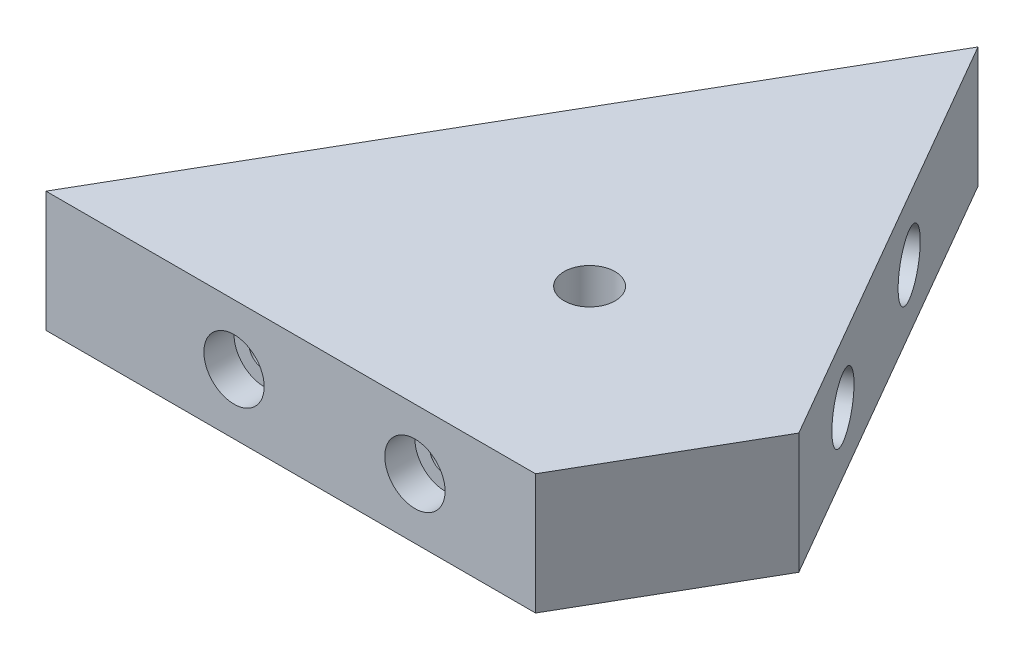
ISO-10303-21;
HEADER;
FILE_DESCRIPTION(('STEP AP214'),'2;1');
FILE_NAME('part.step','',(''),(''),'','','');
FILE_SCHEMA(('AUTOMOTIVE_DESIGN { 1 0 10303 214 1 1 1 1 }'));
ENDSEC;
DATA;
#1=APPLICATION_CONTEXT('core data for automotive mechanical design processes');
#2=APPLICATION_PROTOCOL_DEFINITION('international standard','automotive_design',2000,#1);
#3=PRODUCT_CONTEXT('',#1,'mechanical');
#4=PRODUCT('Part','Part','',(#3));
#5=PRODUCT_RELATED_PRODUCT_CATEGORY('part','',(#4));
#6=PRODUCT_DEFINITION_FORMATION('','',#4);
#7=PRODUCT_DEFINITION_CONTEXT('part definition',#1,'design');
#8=PRODUCT_DEFINITION('design','',#6,#7);
#9=PRODUCT_DEFINITION_SHAPE('','',#8);
#10=(LENGTH_UNIT() NAMED_UNIT(*) SI_UNIT(.MILLI.,.METRE.));
#11=(NAMED_UNIT(*) PLANE_ANGLE_UNIT() SI_UNIT($,.RADIAN.));
#12=(NAMED_UNIT(*) SI_UNIT($,.STERADIAN.) SOLID_ANGLE_UNIT());
#13=UNCERTAINTY_MEASURE_WITH_UNIT(LENGTH_MEASURE(1.E-05),#10,'distance_accuracy_value','');
#14=(GEOMETRIC_REPRESENTATION_CONTEXT(3) GLOBAL_UNCERTAINTY_ASSIGNED_CONTEXT((#13)) GLOBAL_UNIT_ASSIGNED_CONTEXT((#10,
#11,#12)) REPRESENTATION_CONTEXT('',''));
#15=CARTESIAN_POINT('',(0.,0.,0.));
#16=DIRECTION('',(0.,0.,1.));
#17=DIRECTION('',(1.,0.,0.));
#18=AXIS2_PLACEMENT_3D('',#15,#16,#17);
#19=CARTESIAN_POINT('',(15.973610966499,25.4,241.162389864387));
#20=DIRECTION('',(0.,0.,-1.));
#21=DIRECTION('',(-1.,0.,0.));
#22=AXIS2_PLACEMENT_3D('',#19,#20,#21);
#23=PLANE('',#22);
#24=CARTESIAN_POINT('',(55.5682924275236,12.7,241.162389864387));
#25=DIRECTION('',(0.,0.,1.));
#26=DIRECTION('',(1.,0.,0.));
#27=AXIS2_PLACEMENT_3D('',#24,#25,#26);
#28=CIRCLE('',#27,6.35);
#29=CARTESIAN_POINT('',(61.9182924275236,12.7,241.162389864387));
#30=VERTEX_POINT('',#29);
#31=EDGE_CURVE('E144',#30,#30,#28,.T.);
#32=ORIENTED_EDGE('',*,*,#31,.F.);
#33=EDGE_LOOP('',(#32));
#34=FACE_BOUND('',#33,.T.);
#35=CARTESIAN_POINT('',(93.6682924275236,12.7,241.162389864387));
#36=DIRECTION('',(0.,0.,1.));
#37=DIRECTION('',(1.,0.,0.));
#38=AXIS2_PLACEMENT_3D('',#35,#36,#37);
#39=CIRCLE('',#38,6.35);
#40=CARTESIAN_POINT('',(100.018292427524,12.7,241.162389864387));
#41=VERTEX_POINT('',#40);
#42=EDGE_CURVE('E148',#41,#41,#39,.T.);
#43=ORIENTED_EDGE('',*,*,#42,.F.);
#44=EDGE_LOOP('',(#43));
#45=FACE_BOUND('',#44,.T.);
#46=DIRECTION('',(1.,0.,0.));
#47=VECTOR('',#46,1.);
#48=CARTESIAN_POINT('',(15.973610966499,0.,241.162389864387));
#49=LINE('',#48,#47);
#50=CARTESIAN_POINT('',(15.973610966499,0.,241.162389864387));
#51=VERTEX_POINT('',#50);
#52=CARTESIAN_POINT('',(119.068292427524,0.,241.162389864387));
#53=VERTEX_POINT('',#52);
#54=EDGE_CURVE('E95',#51,#53,#49,.T.);
#55=ORIENTED_EDGE('',*,*,#54,.T.);
#56=DIRECTION('',(0.,-1.,0.));
#57=VECTOR('',#56,1.);
#58=CARTESIAN_POINT('',(119.068292427524,25.4,241.162389864387));
#59=LINE('',#58,#57);
#60=CARTESIAN_POINT('',(119.068292427524,25.4,241.162389864387));
#61=VERTEX_POINT('',#60);
#62=EDGE_CURVE('E11',#61,#53,#59,.T.);
#63=ORIENTED_EDGE('',*,*,#62,.F.);
#64=DIRECTION('',(1.,0.,0.));
#65=VECTOR('',#64,1.);
#66=CARTESIAN_POINT('',(15.973610966499,25.4,241.162389864387));
#67=LINE('',#66,#65);
#68=CARTESIAN_POINT('',(15.973610966499,25.4,241.162389864387));
#69=VERTEX_POINT('',#68);
#70=EDGE_CURVE('E155',#69,#61,#67,.T.);
#71=ORIENTED_EDGE('',*,*,#70,.F.);
#72=DIRECTION('',(0.,-1.,0.));
#73=VECTOR('',#72,1.);
#74=CARTESIAN_POINT('',(15.973610966499,25.4,241.162389864387));
#75=LINE('',#74,#73);
#76=EDGE_CURVE('E54',#69,#51,#75,.T.);
#77=ORIENTED_EDGE('',*,*,#76,.T.);
#78=EDGE_LOOP('',(#55,#63,#71,#77));
#79=FACE_BOUND('',#78,.T.);
#80=ADVANCED_FACE('F45',(#34,#45,#79),#23,.F.);
#81=CARTESIAN_POINT('',(119.068292427524,25.4,241.162389864387));
#82=DIRECTION('',(-0.866025403784439,0.,-0.5));
#83=DIRECTION('',(-0.5,0.,0.866025403784439));
#84=AXIS2_PLACEMENT_3D('',#81,#82,#83);
#85=PLANE('',#84);
#86=DIRECTION('',(0.5,0.,-0.866025403784439));
#87=VECTOR('',#86,1.);
#88=CARTESIAN_POINT('',(119.068292427524,0.,241.162389864387));
#89=LINE('',#88,#87);
#90=CARTESIAN_POINT('',(139.363860311711,0.,206.009435120512));
#91=VERTEX_POINT('',#90);
#92=EDGE_CURVE('E74',#53,#91,#89,.T.);
#93=ORIENTED_EDGE('',*,*,#92,.T.);
#94=DIRECTION('',(0.,-1.,0.));
#95=VECTOR('',#94,1.);
#96=CARTESIAN_POINT('',(139.363860311711,25.4,206.009435120512));
#97=LINE('',#96,#95);
#98=CARTESIAN_POINT('',(139.363860311711,25.4,206.009435120512));
#99=VERTEX_POINT('',#98);
#100=EDGE_CURVE('E89',#99,#91,#97,.T.);
#101=ORIENTED_EDGE('',*,*,#100,.F.);
#102=DIRECTION('',(0.5,0.,-0.866025403784439));
#103=VECTOR('',#102,1.);
#104=CARTESIAN_POINT('',(119.068292427524,25.4,241.162389864387));
#105=LINE('',#104,#103);
#106=EDGE_CURVE('E79',#61,#99,#105,.T.);
#107=ORIENTED_EDGE('',*,*,#106,.F.);
#108=ORIENTED_EDGE('',*,*,#62,.T.);
#109=EDGE_LOOP('',(#93,#101,#107,#108));
#110=FACE_BOUND('',#109,.T.);
#111=ADVANCED_FACE('F88',(#110),#85,.F.);
#112=CARTESIAN_POINT('',(15.973610966499,25.4,241.162389864387));
#113=DIRECTION('',(0.866025403784439,0.,0.5));
#114=DIRECTION('',(0.5,0.,-0.866025403784439));
#115=AXIS2_PLACEMENT_3D('',#112,#113,#114);
#116=PLANE('',#115);
#117=DIRECTION('',(-0.5,0.,0.866025403784439));
#118=VECTOR('',#117,1.);
#119=CARTESIAN_POINT('',(15.973610966499,0.,241.162389864387));
#120=LINE('',#119,#118);
#121=CARTESIAN_POINT('',(87.8165195811983,0.,116.7268219802));
#122=VERTEX_POINT('',#121);
#123=EDGE_CURVE('E94',#122,#51,#120,.T.);
#124=ORIENTED_EDGE('',*,*,#123,.T.);
#125=ORIENTED_EDGE('',*,*,#76,.F.);
#126=DIRECTION('',(-0.5,0.,0.866025403784439));
#127=VECTOR('',#126,1.);
#128=CARTESIAN_POINT('',(15.973610966499,25.4,241.162389864387));
#129=LINE('',#128,#127);
#130=CARTESIAN_POINT('',(87.8165195811983,25.4,116.7268219802));
#131=VERTEX_POINT('',#130);
#132=EDGE_CURVE('E62',#131,#69,#129,.T.);
#133=ORIENTED_EDGE('',*,*,#132,.F.);
#134=DIRECTION('',(0.,-1.,0.));
#135=VECTOR('',#134,1.);
#136=CARTESIAN_POINT('',(87.8165195811983,25.4,116.7268219802));
#137=LINE('',#136,#135);
#138=EDGE_CURVE('E104',#131,#122,#137,.T.);
#139=ORIENTED_EDGE('',*,*,#138,.T.);
#140=EDGE_LOOP('',(#124,#125,#133,#139));
#141=FACE_BOUND('',#140,.T.);
#142=ADVANCED_FACE('F172',(#141),#116,.F.);
#143=CARTESIAN_POINT('',(0.,25.4,0.));
#144=DIRECTION('',(0.,1.,0.));
#145=DIRECTION('',(0.,0.,1.));
#146=AXIS2_PLACEMENT_3D('',#143,#144,#145);
#147=PLANE('',#146);
#148=CARTESIAN_POINT('',(90.5555708217328,25.4,201.265259207372));
#149=DIRECTION('',(0.,1.,0.));
#150=DIRECTION('',(0.,0.,1.));
#151=AXIS2_PLACEMENT_3D('',#148,#149,#150);
#152=CIRCLE('',#151,5.3578125);
#153=CARTESIAN_POINT('',(90.5555708217328,25.4,206.623071707372));
#154=VERTEX_POINT('',#153);
#155=EDGE_CURVE('E275',#154,#154,#152,.T.);
#156=ORIENTED_EDGE('',*,*,#155,.F.);
#157=EDGE_LOOP('',(#156));
#158=FACE_BOUND('',#157,.T.);
#159=ORIENTED_EDGE('',*,*,#70,.T.);
#160=ORIENTED_EDGE('',*,*,#106,.T.);
#161=DIRECTION('',(0.5,0.,0.866025403784439));
#162=VECTOR('',#161,1.);
#163=CARTESIAN_POINT('',(87.8165195811983,25.4,116.7268219802));
#164=LINE('',#163,#162);
#165=EDGE_CURVE('E102',#131,#99,#164,.T.);
#166=ORIENTED_EDGE('',*,*,#165,.F.);
#167=ORIENTED_EDGE('',*,*,#132,.T.);
#168=EDGE_LOOP('',(#159,#160,#166,#167));
#169=FACE_BOUND('',#168,.T.);
#170=ADVANCED_FACE('F173',(#158,#169),#147,.T.);
#171=CARTESIAN_POINT('',(0.,0.,0.));
#172=DIRECTION('',(0.,1.,0.));
#173=DIRECTION('',(0.,0.,1.));
#174=AXIS2_PLACEMENT_3D('',#171,#172,#173);
#175=PLANE('',#174);
#176=CARTESIAN_POINT('',(90.5555708217328,0.,201.265259207372));
#177=DIRECTION('',(0.,1.,0.));
#178=DIRECTION('',(0.,0.,1.));
#179=AXIS2_PLACEMENT_3D('',#176,#177,#178);
#180=CIRCLE('',#179,5.3578125);
#181=CARTESIAN_POINT('',(90.5555708217328,0.,206.623071707372));
#182=VERTEX_POINT('',#181);
#183=EDGE_CURVE('E273',#182,#182,#180,.T.);
#184=ORIENTED_EDGE('',*,*,#183,.T.);
#185=EDGE_LOOP('',(#184));
#186=FACE_BOUND('',#185,.T.);
#187=ORIENTED_EDGE('',*,*,#54,.F.);
#188=ORIENTED_EDGE('',*,*,#123,.F.);
#189=DIRECTION('',(0.5,0.,0.866025403784439));
#190=VECTOR('',#189,1.);
#191=CARTESIAN_POINT('',(87.8165195811983,0.,116.7268219802));
#192=LINE('',#191,#190);
#193=EDGE_CURVE('E101',#122,#91,#192,.T.);
#194=ORIENTED_EDGE('',*,*,#193,.T.);
#195=ORIENTED_EDGE('',*,*,#92,.F.);
#196=EDGE_LOOP('',(#187,#188,#194,#195));
#197=FACE_BOUND('',#196,.T.);
#198=ADVANCED_FACE('F106',(#186,#197),#175,.F.);
#199=CARTESIAN_POINT('',(93.6682924275236,12.7,234.812389864387));
#200=DIRECTION('',(0.,0.,1.));
#201=DIRECTION('',(1.,0.,0.));
#202=AXIS2_PLACEMENT_3D('',#199,#200,#201);
#203=CYLINDRICAL_SURFACE('',#202,6.35);
#204=CARTESIAN_POINT('',(93.6682924275236,12.7,234.812389864387));
#205=DIRECTION('',(0.,0.,1.));
#206=DIRECTION('',(1.,0.,0.));
#207=AXIS2_PLACEMENT_3D('',#204,#205,#206);
#208=CIRCLE('',#207,6.35);
#209=CARTESIAN_POINT('',(100.018292427524,12.7,234.812389864387));
#210=VERTEX_POINT('',#209);
#211=EDGE_CURVE('E136',#210,#210,#208,.T.);
#212=ORIENTED_EDGE('',*,*,#211,.F.);
#213=EDGE_LOOP('',(#212));
#214=FACE_BOUND('',#213,.T.);
#215=ORIENTED_EDGE('',*,*,#42,.T.);
#216=EDGE_LOOP('',(#215));
#217=FACE_BOUND('',#216,.T.);
#218=ADVANCED_FACE('F181',(#214,#217),#203,.F.);
#219=CARTESIAN_POINT('',(93.6682924275236,12.7,234.812389864387));
#220=DIRECTION('',(0.,0.,1.));
#221=DIRECTION('',(1.,0.,0.));
#222=AXIS2_PLACEMENT_3D('',#219,#220,#221);
#223=PLANE('',#222);
#224=CARTESIAN_POINT('',(93.6682924275235,12.7,234.812389864387));
#225=DIRECTION('',(0.,0.,1.));
#226=DIRECTION('',(1.,0.,0.));
#227=AXIS2_PLACEMENT_3D('',#224,#225,#226);
#228=CIRCLE('',#227,3.26389999999999);
#229=CARTESIAN_POINT('',(96.9321924275235,12.7,234.812389864387));
#230=VERTEX_POINT('',#229);
#231=EDGE_CURVE('E123',#230,#230,#228,.T.);
#232=ORIENTED_EDGE('',*,*,#231,.F.);
#233=EDGE_LOOP('',(#232));
#234=FACE_BOUND('',#233,.T.);
#235=ORIENTED_EDGE('',*,*,#211,.T.);
#236=EDGE_LOOP('',(#235));
#237=FACE_BOUND('',#236,.T.);
#238=ADVANCED_FACE('F197',(#234,#237),#223,.T.);
#239=CARTESIAN_POINT('',(55.5682924275236,12.7,234.812389864387));
#240=DIRECTION('',(0.,0.,1.));
#241=DIRECTION('',(1.,0.,0.));
#242=AXIS2_PLACEMENT_3D('',#239,#240,#241);
#243=CYLINDRICAL_SURFACE('',#242,6.35);
#244=CARTESIAN_POINT('',(55.5682924275236,12.7,234.812389864387));
#245=DIRECTION('',(0.,0.,1.));
#246=DIRECTION('',(1.,0.,0.));
#247=AXIS2_PLACEMENT_3D('',#244,#245,#246);
#248=CIRCLE('',#247,6.35);
#249=CARTESIAN_POINT('',(61.9182924275236,12.7,234.812389864387));
#250=VERTEX_POINT('',#249);
#251=EDGE_CURVE('E140',#250,#250,#248,.T.);
#252=ORIENTED_EDGE('',*,*,#251,.F.);
#253=EDGE_LOOP('',(#252));
#254=FACE_BOUND('',#253,.T.);
#255=ORIENTED_EDGE('',*,*,#31,.T.);
#256=EDGE_LOOP('',(#255));
#257=FACE_BOUND('',#256,.T.);
#258=ADVANCED_FACE('F203',(#254,#257),#243,.F.);
#259=CARTESIAN_POINT('',(55.5682924275236,12.7,234.812389864387));
#260=DIRECTION('',(0.,0.,1.));
#261=DIRECTION('',(1.,0.,0.));
#262=AXIS2_PLACEMENT_3D('',#259,#260,#261);
#263=PLANE('',#262);
#264=CARTESIAN_POINT('',(55.5682924275236,12.7,234.812389864387));
#265=DIRECTION('',(0.,0.,1.));
#266=DIRECTION('',(1.,0.,0.));
#267=AXIS2_PLACEMENT_3D('',#264,#265,#266);
#268=CIRCLE('',#267,3.2639);
#269=CARTESIAN_POINT('',(58.8321924275236,12.7,234.812389864387));
#270=VERTEX_POINT('',#269);
#271=EDGE_CURVE('E128',#270,#270,#268,.T.);
#272=ORIENTED_EDGE('',*,*,#271,.F.);
#273=EDGE_LOOP('',(#272));
#274=FACE_BOUND('',#273,.T.);
#275=ORIENTED_EDGE('',*,*,#251,.T.);
#276=EDGE_LOOP('',(#275));
#277=FACE_BOUND('',#276,.T.);
#278=ADVANCED_FACE('F209',(#274,#277),#263,.T.);
#279=CARTESIAN_POINT('',(55.5682924275236,12.7,218.302389864387));
#280=DIRECTION('',(0.,0.,1.));
#281=DIRECTION('',(1.,0.,0.));
#282=AXIS2_PLACEMENT_3D('',#279,#280,#281);
#283=CYLINDRICAL_SURFACE('',#282,3.2639);
#284=CARTESIAN_POINT('',(55.5682924275236,12.7,218.302389864387));
#285=DIRECTION('',(0.,0.,1.));
#286=DIRECTION('',(1.,0.,0.));
#287=AXIS2_PLACEMENT_3D('',#284,#285,#286);
#288=CIRCLE('',#287,3.2639);
#289=CARTESIAN_POINT('',(58.8321924275236,12.7,218.302389864387));
#290=VERTEX_POINT('',#289);
#291=EDGE_CURVE('E132',#290,#290,#288,.T.);
#292=ORIENTED_EDGE('',*,*,#291,.F.);
#293=EDGE_LOOP('',(#292));
#294=FACE_BOUND('',#293,.T.);
#295=ORIENTED_EDGE('',*,*,#271,.T.);
#296=EDGE_LOOP('',(#295));
#297=FACE_BOUND('',#296,.T.);
#298=ADVANCED_FACE('F213',(#294,#297),#283,.F.);
#299=CARTESIAN_POINT('',(55.5682924275236,12.7,218.302389864387));
#300=DIRECTION('',(0.,0.,1.));
#301=DIRECTION('',(1.,0.,0.));
#302=AXIS2_PLACEMENT_3D('',#299,#300,#301);
#303=PLANE('',#302);
#304=ORIENTED_EDGE('',*,*,#291,.T.);
#305=EDGE_LOOP('',(#304));
#306=FACE_BOUND('',#305,.T.);
#307=ADVANCED_FACE('F217',(#306),#303,.T.);
#308=CARTESIAN_POINT('',(93.6682924275235,12.7,218.302389864387));
#309=DIRECTION('',(0.,0.,1.));
#310=DIRECTION('',(1.,0.,0.));
#311=AXIS2_PLACEMENT_3D('',#308,#309,#310);
#312=CYLINDRICAL_SURFACE('',#311,3.26389999999999);
#313=CARTESIAN_POINT('',(93.6682924275235,12.7,218.302389864387));
#314=DIRECTION('',(0.,0.,1.));
#315=DIRECTION('',(1.,0.,0.));
#316=AXIS2_PLACEMENT_3D('',#313,#314,#315);
#317=CIRCLE('',#316,3.26389999999999);
#318=CARTESIAN_POINT('',(96.9321924275235,12.7,218.302389864387));
#319=VERTEX_POINT('',#318);
#320=EDGE_CURVE('E124',#319,#319,#317,.T.);
#321=ORIENTED_EDGE('',*,*,#320,.F.);
#322=EDGE_LOOP('',(#321));
#323=FACE_BOUND('',#322,.T.);
#324=ORIENTED_EDGE('',*,*,#231,.T.);
#325=EDGE_LOOP('',(#324));
#326=FACE_BOUND('',#325,.T.);
#327=ADVANCED_FACE('F221',(#323,#326),#312,.F.);
#328=CARTESIAN_POINT('',(93.6682924275235,12.7,218.302389864387));
#329=DIRECTION('',(0.,0.,1.));
#330=DIRECTION('',(1.,0.,0.));
#331=AXIS2_PLACEMENT_3D('',#328,#329,#330);
#332=PLANE('',#331);
#333=ORIENTED_EDGE('',*,*,#320,.T.);
#334=EDGE_LOOP('',(#333));
#335=FACE_BOUND('',#334,.T.);
#336=ADVANCED_FACE('F225',(#335),#332,.T.);
#337=CARTESIAN_POINT('',(87.8165195811983,25.4,116.7268219802));
#338=DIRECTION('',(0.866025403784439,0.,-0.5));
#339=DIRECTION('',(-0.5,0.,-0.866025403784439));
#340=AXIS2_PLACEMENT_3D('',#337,#338,#339);
#341=PLANE('',#340);
#342=CARTESIAN_POINT('',(107.613860311711,12.7,151.0168219802));
#343=DIRECTION('',(-0.866025403784438,0.,0.500000000000001));
#344=DIRECTION('',(0.5,0.,0.866025403784438));
#345=AXIS2_PLACEMENT_3D('',#342,#343,#344);
#346=CIRCLE('',#345,6.35);
#347=CARTESIAN_POINT('',(110.788860311711,12.7,156.516083294231));
#348=VERTEX_POINT('',#347);
#349=EDGE_CURVE('E117',#348,#348,#346,.T.);
#350=ORIENTED_EDGE('',*,*,#349,.T.);
#351=EDGE_LOOP('',(#350));
#352=FACE_BOUND('',#351,.T.);
#353=CARTESIAN_POINT('',(126.663860311711,12.7,184.012389864387));
#354=DIRECTION('',(-0.866025403784438,0.,0.500000000000001));
#355=DIRECTION('',(0.5,0.,0.866025403784438));
#356=AXIS2_PLACEMENT_3D('',#353,#354,#355);
#357=CIRCLE('',#356,6.35);
#358=CARTESIAN_POINT('',(129.838860311711,12.7,189.511651178418));
#359=VERTEX_POINT('',#358);
#360=EDGE_CURVE('E296',#359,#359,#357,.T.);
#361=ORIENTED_EDGE('',*,*,#360,.T.);
#362=EDGE_LOOP('',(#361));
#363=FACE_BOUND('',#362,.T.);
#364=ORIENTED_EDGE('',*,*,#193,.F.);
#365=ORIENTED_EDGE('',*,*,#138,.F.);
#366=ORIENTED_EDGE('',*,*,#165,.T.);
#367=ORIENTED_EDGE('',*,*,#100,.T.);
#368=EDGE_LOOP('',(#364,#365,#366,#367));
#369=FACE_BOUND('',#368,.T.);
#370=ADVANCED_FACE('F99',(#352,#363,#369),#341,.T.);
#371=CARTESIAN_POINT('',(121.164598997679,12.7,187.187389864387));
#372=DIRECTION('',(0.866025403784438,0.,-0.500000000000001));
#373=DIRECTION('',(-0.500000000000001,0.,-0.866025403784438));
#374=AXIS2_PLACEMENT_3D('',#371,#372,#373);
#375=CYLINDRICAL_SURFACE('',#374,6.35);
#376=CARTESIAN_POINT('',(121.164598997679,12.7,187.187389864387));
#377=DIRECTION('',(-0.866025403784438,0.,0.500000000000001));
#378=DIRECTION('',(0.5,0.,0.866025403784438));
#379=AXIS2_PLACEMENT_3D('',#376,#377,#378);
#380=CIRCLE('',#379,6.35);
#381=CARTESIAN_POINT('',(124.339598997679,12.7,192.686651178418));
#382=VERTEX_POINT('',#381);
#383=EDGE_CURVE('E303',#382,#382,#380,.T.);
#384=ORIENTED_EDGE('',*,*,#383,.T.);
#385=EDGE_LOOP('',(#384));
#386=FACE_BOUND('',#385,.T.);
#387=ORIENTED_EDGE('',*,*,#360,.F.);
#388=EDGE_LOOP('',(#387));
#389=FACE_BOUND('',#388,.T.);
#390=ADVANCED_FACE('F232',(#386,#389),#375,.F.);
#391=CARTESIAN_POINT('',(121.164598997679,12.7,187.187389864387));
#392=DIRECTION('',(0.866025403784438,0.,-0.500000000000001));
#393=DIRECTION('',(0.5,0.,0.866025403784438));
#394=AXIS2_PLACEMENT_3D('',#391,#392,#393);
#395=PLANE('',#394);
#396=CARTESIAN_POINT('',(121.164598997679,12.7,187.187389864387));
#397=DIRECTION('',(-0.866025403784438,0.,0.500000000000001));
#398=DIRECTION('',(0.5,0.,0.866025403784438));
#399=AXIS2_PLACEMENT_3D('',#396,#397,#398);
#400=CIRCLE('',#399,3.26389999999999);
#401=CARTESIAN_POINT('',(122.796548997679,12.7,190.014010179799));
#402=VERTEX_POINT('',#401);
#403=EDGE_CURVE('E281',#402,#402,#400,.T.);
#404=ORIENTED_EDGE('',*,*,#403,.T.);
#405=EDGE_LOOP('',(#404));
#406=FACE_BOUND('',#405,.T.);
#407=ORIENTED_EDGE('',*,*,#383,.F.);
#408=EDGE_LOOP('',(#407));
#409=FACE_BOUND('',#408,.T.);
#410=ADVANCED_FACE('F236',(#406,#409),#395,.T.);
#411=CARTESIAN_POINT('',(102.114598997679,12.7,154.1918219802));
#412=DIRECTION('',(0.866025403784438,0.,-0.500000000000001));
#413=DIRECTION('',(-0.500000000000001,0.,-0.866025403784438));
#414=AXIS2_PLACEMENT_3D('',#411,#412,#413);
#415=CYLINDRICAL_SURFACE('',#414,6.35);
#416=CARTESIAN_POINT('',(102.114598997679,12.7,154.1918219802));
#417=DIRECTION('',(-0.866025403784438,0.,0.500000000000001));
#418=DIRECTION('',(0.5,0.,0.866025403784438));
#419=AXIS2_PLACEMENT_3D('',#416,#417,#418);
#420=CIRCLE('',#419,6.35);
#421=CARTESIAN_POINT('',(105.289598997679,12.7,159.691083294231));
#422=VERTEX_POINT('',#421);
#423=EDGE_CURVE('E109',#422,#422,#420,.T.);
#424=ORIENTED_EDGE('',*,*,#423,.T.);
#425=EDGE_LOOP('',(#424));
#426=FACE_BOUND('',#425,.T.);
#427=ORIENTED_EDGE('',*,*,#349,.F.);
#428=EDGE_LOOP('',(#427));
#429=FACE_BOUND('',#428,.T.);
#430=ADVANCED_FACE('F240',(#426,#429),#415,.F.);
#431=CARTESIAN_POINT('',(102.114598997679,12.7,154.1918219802));
#432=DIRECTION('',(0.866025403784438,0.,-0.500000000000001));
#433=DIRECTION('',(0.5,0.,0.866025403784438));
#434=AXIS2_PLACEMENT_3D('',#431,#432,#433);
#435=PLANE('',#434);
#436=CARTESIAN_POINT('',(102.114598997679,12.7,154.1918219802));
#437=DIRECTION('',(-0.866025403784438,0.,0.500000000000001));
#438=DIRECTION('',(0.5,0.,0.866025403784438));
#439=AXIS2_PLACEMENT_3D('',#436,#437,#438);
#440=CIRCLE('',#439,3.2639);
#441=CARTESIAN_POINT('',(103.746548997679,12.7,157.018442295612));
#442=VERTEX_POINT('',#441);
#443=EDGE_CURVE('E288',#442,#442,#440,.T.);
#444=ORIENTED_EDGE('',*,*,#443,.T.);
#445=EDGE_LOOP('',(#444));
#446=FACE_BOUND('',#445,.T.);
#447=ORIENTED_EDGE('',*,*,#423,.F.);
#448=EDGE_LOOP('',(#447));
#449=FACE_BOUND('',#448,.T.);
#450=ADVANCED_FACE('F244',(#446,#449),#435,.T.);
#451=CARTESIAN_POINT('',(87.8165195811983,12.7,162.4468219802));
#452=DIRECTION('',(0.866025403784438,0.,-0.500000000000001));
#453=DIRECTION('',(-0.500000000000001,0.,-0.866025403784438));
#454=AXIS2_PLACEMENT_3D('',#451,#452,#453);
#455=CYLINDRICAL_SURFACE('',#454,3.2639);
#456=CARTESIAN_POINT('',(87.8165195811983,12.7,162.4468219802));
#457=DIRECTION('',(-0.866025403784438,0.,0.500000000000001));
#458=DIRECTION('',(0.5,0.,0.866025403784438));
#459=AXIS2_PLACEMENT_3D('',#456,#457,#458);
#460=CIRCLE('',#459,3.2639);
#461=CARTESIAN_POINT('',(89.4484695811983,12.7,165.273442295612));
#462=VERTEX_POINT('',#461);
#463=EDGE_CURVE('E292',#462,#462,#460,.T.);
#464=ORIENTED_EDGE('',*,*,#463,.T.);
#465=EDGE_LOOP('',(#464));
#466=FACE_BOUND('',#465,.T.);
#467=ORIENTED_EDGE('',*,*,#443,.F.);
#468=EDGE_LOOP('',(#467));
#469=FACE_BOUND('',#468,.T.);
#470=ADVANCED_FACE('F248',(#466,#469),#455,.F.);
#471=CARTESIAN_POINT('',(87.8165195811983,12.7,162.4468219802));
#472=DIRECTION('',(0.866025403784438,0.,-0.500000000000001));
#473=DIRECTION('',(0.5,0.,0.866025403784438));
#474=AXIS2_PLACEMENT_3D('',#471,#472,#473);
#475=PLANE('',#474);
#476=ORIENTED_EDGE('',*,*,#463,.F.);
#477=EDGE_LOOP('',(#476));
#478=FACE_BOUND('',#477,.T.);
#479=ADVANCED_FACE('F252',(#478),#475,.T.);
#480=CARTESIAN_POINT('',(106.866519581198,12.7,195.442389864387));
#481=DIRECTION('',(0.866025403784438,0.,-0.500000000000001));
#482=DIRECTION('',(-0.500000000000001,0.,-0.866025403784438));
#483=AXIS2_PLACEMENT_3D('',#480,#481,#482);
#484=CYLINDRICAL_SURFACE('',#483,3.26389999999999);
#485=CARTESIAN_POINT('',(106.866519581198,12.7,195.442389864387));
#486=DIRECTION('',(-0.866025403784438,0.,0.500000000000001));
#487=DIRECTION('',(0.5,0.,0.866025403784438));
#488=AXIS2_PLACEMENT_3D('',#485,#486,#487);
#489=CIRCLE('',#488,3.26389999999999);
#490=CARTESIAN_POINT('',(108.498469581198,12.7,198.269010179799));
#491=VERTEX_POINT('',#490);
#492=EDGE_CURVE('E284',#491,#491,#489,.T.);
#493=ORIENTED_EDGE('',*,*,#492,.T.);
#494=EDGE_LOOP('',(#493));
#495=FACE_BOUND('',#494,.T.);
#496=ORIENTED_EDGE('',*,*,#403,.F.);
#497=EDGE_LOOP('',(#496));
#498=FACE_BOUND('',#497,.T.);
#499=ADVANCED_FACE('F256',(#495,#498),#484,.F.);
#500=CARTESIAN_POINT('',(106.866519581198,12.7,195.442389864387));
#501=DIRECTION('',(0.866025403784438,0.,-0.500000000000001));
#502=DIRECTION('',(0.5,0.,0.866025403784438));
#503=AXIS2_PLACEMENT_3D('',#500,#501,#502);
#504=PLANE('',#503);
#505=ORIENTED_EDGE('',*,*,#492,.F.);
#506=EDGE_LOOP('',(#505));
#507=FACE_BOUND('',#506,.T.);
#508=ADVANCED_FACE('F260',(#507),#504,.T.);
#509=CARTESIAN_POINT('',(90.5555708217328,0.,201.265259207372));
#510=DIRECTION('',(0.,1.,0.));
#511=DIRECTION('',(0.,0.,1.));
#512=AXIS2_PLACEMENT_3D('',#509,#510,#511);
#513=CYLINDRICAL_SURFACE('',#512,5.3578125);
#514=ORIENTED_EDGE('',*,*,#183,.F.);
#515=EDGE_LOOP('',(#514));
#516=FACE_BOUND('',#515,.T.);
#517=ORIENTED_EDGE('',*,*,#155,.T.);
#518=EDGE_LOOP('',(#517));
#519=FACE_BOUND('',#518,.T.);
#520=ADVANCED_FACE('F264',(#516,#519),#513,.F.);
#521=CLOSED_SHELL('',(#80,#111,#142,#170,#198,#218,#238,#258,#278,#298,#307,#327,#336,#370,#390,
#410,#430,#450,#470,#479,#499,#508,#520));
#522=MANIFOLD_SOLID_BREP('B2',#521);
#523=ADVANCED_BREP_SHAPE_REPRESENTATION('',(#18,#522),#14);
#524=SHAPE_DEFINITION_REPRESENTATION(#9,#523);
ENDSEC;
END-ISO-10303-21;
